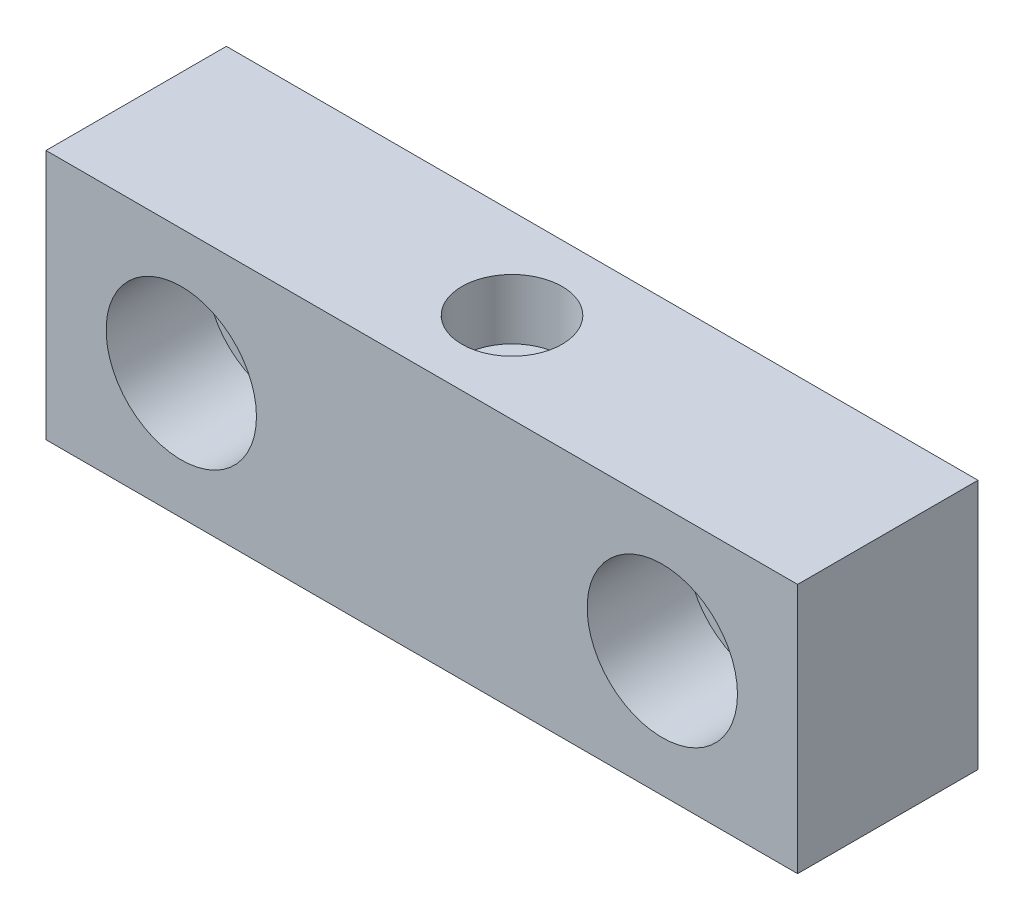
ISO-10303-21;
HEADER;
FILE_DESCRIPTION(('STEP AP214'),'2;1');
FILE_NAME('part.step','',(''),(''),'','','');
FILE_SCHEMA(('AUTOMOTIVE_DESIGN { 1 0 10303 214 1 1 1 1 }'));
ENDSEC;
DATA;
#1=APPLICATION_CONTEXT('core data for automotive mechanical design processes');
#2=APPLICATION_PROTOCOL_DEFINITION('international standard','automotive_design',2000,#1);
#3=PRODUCT_CONTEXT('',#1,'mechanical');
#4=PRODUCT('Part','Part','',(#3));
#5=PRODUCT_RELATED_PRODUCT_CATEGORY('part','',(#4));
#6=PRODUCT_DEFINITION_FORMATION('','',#4);
#7=PRODUCT_DEFINITION_CONTEXT('part definition',#1,'design');
#8=PRODUCT_DEFINITION('design','',#6,#7);
#9=PRODUCT_DEFINITION_SHAPE('','',#8);
#10=(LENGTH_UNIT() NAMED_UNIT(*) SI_UNIT(.MILLI.,.METRE.));
#11=(NAMED_UNIT(*) PLANE_ANGLE_UNIT() SI_UNIT($,.RADIAN.));
#12=(NAMED_UNIT(*) SI_UNIT($,.STERADIAN.) SOLID_ANGLE_UNIT());
#13=UNCERTAINTY_MEASURE_WITH_UNIT(LENGTH_MEASURE(1.E-05),#10,'distance_accuracy_value','');
#14=(GEOMETRIC_REPRESENTATION_CONTEXT(3) GLOBAL_UNCERTAINTY_ASSIGNED_CONTEXT((#13)) GLOBAL_UNIT_ASSIGNED_CONTEXT((#10,
#11,#12)) REPRESENTATION_CONTEXT('',''));
#15=CARTESIAN_POINT('',(0.,0.,0.));
#16=DIRECTION('',(0.,0.,1.));
#17=DIRECTION('',(1.,0.,0.));
#18=AXIS2_PLACEMENT_3D('',#15,#16,#17);
#19=CARTESIAN_POINT('',(0.,12.5,9.));
#20=DIRECTION('',(0.,-1.,0.));
#21=DIRECTION('',(0.,0.,-1.));
#22=AXIS2_PLACEMENT_3D('',#19,#20,#21);
#23=CYLINDRICAL_SURFACE('',#22,2.5);
#24=CARTESIAN_POINT('',(0.,-12.5,9.));
#25=DIRECTION('',(0.,-1.,0.));
#26=DIRECTION('',(0.,0.,-1.));
#27=AXIS2_PLACEMENT_3D('',#24,#25,#26);
#28=CIRCLE('',#27,2.5);
#29=CARTESIAN_POINT('',(0.,-12.5,6.5));
#30=VERTEX_POINT('',#29);
#31=EDGE_CURVE('E137',#30,#30,#28,.T.);
#32=ORIENTED_EDGE('',*,*,#31,.T.);
#33=EDGE_LOOP('',(#32));
#34=FACE_BOUND('',#33,.T.);
#35=CARTESIAN_POINT('',(0.,6.5,9.));
#36=DIRECTION('',(0.,1.,0.));
#37=DIRECTION('',(0.,0.,1.));
#38=AXIS2_PLACEMENT_3D('',#35,#36,#37);
#39=CIRCLE('',#38,2.5);
#40=CARTESIAN_POINT('',(0.,6.5,11.5));
#41=VERTEX_POINT('',#40);
#42=EDGE_CURVE('E42',#41,#41,#39,.F.);
#43=ORIENTED_EDGE('',*,*,#42,.F.);
#44=EDGE_LOOP('',(#43));
#45=FACE_BOUND('',#44,.T.);
#46=ADVANCED_FACE('F38',(#34,#45),#23,.F.);
#47=CARTESIAN_POINT('',(37.5,-12.5,18.));
#48=DIRECTION('',(-1.,0.,0.));
#49=DIRECTION('',(0.,0.,1.));
#50=AXIS2_PLACEMENT_3D('',#47,#48,#49);
#51=PLANE('',#50);
#52=DIRECTION('',(0.,1.,0.));
#53=VECTOR('',#52,1.);
#54=CARTESIAN_POINT('',(37.5,-12.5,0.));
#55=LINE('',#54,#53);
#56=CARTESIAN_POINT('',(37.5,-12.5,0.));
#57=VERTEX_POINT('',#56);
#58=CARTESIAN_POINT('',(37.5,12.5,0.));
#59=VERTEX_POINT('',#58);
#60=EDGE_CURVE('E110',#57,#59,#55,.T.);
#61=ORIENTED_EDGE('',*,*,#60,.T.);
#62=DIRECTION('',(0.,0.,-1.));
#63=VECTOR('',#62,1.);
#64=CARTESIAN_POINT('',(37.5,12.5,18.));
#65=LINE('',#64,#63);
#66=CARTESIAN_POINT('',(37.5,12.5,18.));
#67=VERTEX_POINT('',#66);
#68=EDGE_CURVE('E11',#67,#59,#65,.T.);
#69=ORIENTED_EDGE('',*,*,#68,.F.);
#70=DIRECTION('',(0.,1.,0.));
#71=VECTOR('',#70,1.);
#72=CARTESIAN_POINT('',(37.5,-12.5,18.));
#73=LINE('',#72,#71);
#74=CARTESIAN_POINT('',(37.5,-12.5,18.));
#75=VERTEX_POINT('',#74);
#76=EDGE_CURVE('E92',#75,#67,#73,.T.);
#77=ORIENTED_EDGE('',*,*,#76,.F.);
#78=DIRECTION('',(0.,0.,-1.));
#79=VECTOR('',#78,1.);
#80=CARTESIAN_POINT('',(37.5,-12.5,18.));
#81=LINE('',#80,#79);
#82=EDGE_CURVE('E106',#75,#57,#81,.T.);
#83=ORIENTED_EDGE('',*,*,#82,.T.);
#84=EDGE_LOOP('',(#61,#69,#77,#83));
#85=FACE_BOUND('',#84,.T.);
#86=ADVANCED_FACE('F40',(#85),#51,.F.);
#87=CARTESIAN_POINT('',(-37.5,12.5,18.));
#88=DIRECTION('',(0.,-1.,0.));
#89=DIRECTION('',(0.,0.,-1.));
#90=AXIS2_PLACEMENT_3D('',#87,#88,#89);
#91=PLANE('',#90);
#92=CARTESIAN_POINT('',(0.,12.5,9.));
#93=DIRECTION('',(0.,1.,0.));
#94=DIRECTION('',(0.,0.,1.));
#95=AXIS2_PLACEMENT_3D('',#92,#93,#94);
#96=CIRCLE('',#95,5.);
#97=CARTESIAN_POINT('',(0.,12.5,14.));
#98=VERTEX_POINT('',#97);
#99=EDGE_CURVE('E149',#98,#98,#96,.T.);
#100=ORIENTED_EDGE('',*,*,#99,.F.);
#101=EDGE_LOOP('',(#100));
#102=FACE_BOUND('',#101,.T.);
#103=DIRECTION('',(-1.,0.,0.));
#104=VECTOR('',#103,1.);
#105=CARTESIAN_POINT('',(-37.5,12.5,0.));
#106=LINE('',#105,#104);
#107=CARTESIAN_POINT('',(-37.5,12.5,0.));
#108=VERTEX_POINT('',#107);
#109=EDGE_CURVE('E97',#59,#108,#106,.T.);
#110=ORIENTED_EDGE('',*,*,#109,.T.);
#111=DIRECTION('',(0.,0.,-1.));
#112=VECTOR('',#111,1.);
#113=CARTESIAN_POINT('',(-37.5,12.5,18.));
#114=LINE('',#113,#112);
#115=CARTESIAN_POINT('',(-37.5,12.5,18.));
#116=VERTEX_POINT('',#115);
#117=EDGE_CURVE('E49',#116,#108,#114,.T.);
#118=ORIENTED_EDGE('',*,*,#117,.F.);
#119=DIRECTION('',(-1.,0.,0.));
#120=VECTOR('',#119,1.);
#121=CARTESIAN_POINT('',(-37.5,12.5,18.));
#122=LINE('',#121,#120);
#123=EDGE_CURVE('E87',#67,#116,#122,.T.);
#124=ORIENTED_EDGE('',*,*,#123,.F.);
#125=ORIENTED_EDGE('',*,*,#68,.T.);
#126=EDGE_LOOP('',(#110,#118,#124,#125));
#127=FACE_BOUND('',#126,.T.);
#128=ADVANCED_FACE('F96',(#102,#127),#91,.F.);
#129=CARTESIAN_POINT('',(-37.5,-12.5,18.));
#130=DIRECTION('',(1.,0.,0.));
#131=DIRECTION('',(0.,0.,-1.));
#132=AXIS2_PLACEMENT_3D('',#129,#130,#131);
#133=PLANE('',#132);
#134=DIRECTION('',(0.,-1.,0.));
#135=VECTOR('',#134,1.);
#136=CARTESIAN_POINT('',(-37.5,-12.5,0.));
#137=LINE('',#136,#135);
#138=CARTESIAN_POINT('',(-37.5,-12.5,0.));
#139=VERTEX_POINT('',#138);
#140=EDGE_CURVE('E74',#108,#139,#137,.T.);
#141=ORIENTED_EDGE('',*,*,#140,.T.);
#142=DIRECTION('',(0.,0.,-1.));
#143=VECTOR('',#142,1.);
#144=CARTESIAN_POINT('',(-37.5,-12.5,18.));
#145=LINE('',#144,#143);
#146=CARTESIAN_POINT('',(-37.5,-12.5,18.));
#147=VERTEX_POINT('',#146);
#148=EDGE_CURVE('E99',#147,#139,#145,.T.);
#149=ORIENTED_EDGE('',*,*,#148,.F.);
#150=DIRECTION('',(0.,-1.,0.));
#151=VECTOR('',#150,1.);
#152=CARTESIAN_POINT('',(-37.5,-12.5,18.));
#153=LINE('',#152,#151);
#154=EDGE_CURVE('E90',#116,#147,#153,.T.);
#155=ORIENTED_EDGE('',*,*,#154,.F.);
#156=ORIENTED_EDGE('',*,*,#117,.T.);
#157=EDGE_LOOP('',(#141,#149,#155,#156));
#158=FACE_BOUND('',#157,.T.);
#159=ADVANCED_FACE('F101',(#158),#133,.F.);
#160=CARTESIAN_POINT('',(-37.5,-12.5,18.));
#161=DIRECTION('',(0.,1.,0.));
#162=DIRECTION('',(0.,0.,1.));
#163=AXIS2_PLACEMENT_3D('',#160,#161,#162);
#164=PLANE('',#163);
#165=ORIENTED_EDGE('',*,*,#31,.F.);
#166=EDGE_LOOP('',(#165));
#167=FACE_BOUND('',#166,.T.);
#168=DIRECTION('',(1.,0.,0.));
#169=VECTOR('',#168,1.);
#170=CARTESIAN_POINT('',(-37.5,-12.5,0.));
#171=LINE('',#170,#169);
#172=EDGE_CURVE('E80',#139,#57,#171,.T.);
#173=ORIENTED_EDGE('',*,*,#172,.T.);
#174=ORIENTED_EDGE('',*,*,#82,.F.);
#175=DIRECTION('',(1.,0.,0.));
#176=VECTOR('',#175,1.);
#177=CARTESIAN_POINT('',(-37.5,-12.5,18.));
#178=LINE('',#177,#176);
#179=EDGE_CURVE('E57',#147,#75,#178,.T.);
#180=ORIENTED_EDGE('',*,*,#179,.F.);
#181=ORIENTED_EDGE('',*,*,#148,.T.);
#182=EDGE_LOOP('',(#173,#174,#180,#181));
#183=FACE_BOUND('',#182,.T.);
#184=ADVANCED_FACE('F124',(#167,#183),#164,.F.);
#185=CARTESIAN_POINT('',(0.,0.,18.));
#186=DIRECTION('',(0.,0.,-1.));
#187=DIRECTION('',(-1.,0.,0.));
#188=AXIS2_PLACEMENT_3D('',#185,#186,#187);
#189=PLANE('',#188);
#190=CARTESIAN_POINT('',(-24.,0.,18.));
#191=DIRECTION('',(0.,0.,1.));
#192=DIRECTION('',(1.,0.,0.));
#193=AXIS2_PLACEMENT_3D('',#190,#191,#192);
#194=CIRCLE('',#193,7.5);
#195=CARTESIAN_POINT('',(-16.5,0.,18.));
#196=VERTEX_POINT('',#195);
#197=EDGE_CURVE('E141',#196,#196,#194,.T.);
#198=ORIENTED_EDGE('',*,*,#197,.F.);
#199=EDGE_LOOP('',(#198));
#200=FACE_BOUND('',#199,.T.);
#201=CARTESIAN_POINT('',(24.,0.,18.));
#202=DIRECTION('',(0.,0.,1.));
#203=DIRECTION('',(1.,0.,0.));
#204=AXIS2_PLACEMENT_3D('',#201,#202,#203);
#205=CIRCLE('',#204,7.5);
#206=CARTESIAN_POINT('',(31.5,0.,18.));
#207=VERTEX_POINT('',#206);
#208=EDGE_CURVE('E132',#207,#207,#205,.T.);
#209=ORIENTED_EDGE('',*,*,#208,.F.);
#210=EDGE_LOOP('',(#209));
#211=FACE_BOUND('',#210,.T.);
#212=ORIENTED_EDGE('',*,*,#76,.T.);
#213=ORIENTED_EDGE('',*,*,#123,.T.);
#214=ORIENTED_EDGE('',*,*,#154,.T.);
#215=ORIENTED_EDGE('',*,*,#179,.T.);
#216=EDGE_LOOP('',(#212,#213,#214,#215));
#217=FACE_BOUND('',#216,.T.);
#218=ADVANCED_FACE('F88',(#200,#211,#217),#189,.F.);
#219=CARTESIAN_POINT('',(0.,0.,0.));
#220=DIRECTION('',(0.,0.,-1.));
#221=DIRECTION('',(-1.,0.,0.));
#222=AXIS2_PLACEMENT_3D('',#219,#220,#221);
#223=PLANE('',#222);
#224=ORIENTED_EDGE('',*,*,#60,.F.);
#225=ORIENTED_EDGE('',*,*,#172,.F.);
#226=ORIENTED_EDGE('',*,*,#140,.F.);
#227=ORIENTED_EDGE('',*,*,#109,.F.);
#228=EDGE_LOOP('',(#224,#225,#226,#227));
#229=FACE_BOUND('',#228,.T.);
#230=ADVANCED_FACE('F127',(#229),#223,.T.);
#231=CARTESIAN_POINT('',(24.,0.,8.));
#232=DIRECTION('',(0.,0.,1.));
#233=DIRECTION('',(1.,0.,0.));
#234=AXIS2_PLACEMENT_3D('',#231,#232,#233);
#235=CYLINDRICAL_SURFACE('',#234,7.5);
#236=CARTESIAN_POINT('',(24.,0.,8.));
#237=DIRECTION('',(0.,0.,1.));
#238=DIRECTION('',(1.,0.,0.));
#239=AXIS2_PLACEMENT_3D('',#236,#237,#238);
#240=CIRCLE('',#239,7.5);
#241=CARTESIAN_POINT('',(31.5,0.,8.));
#242=VERTEX_POINT('',#241);
#243=EDGE_CURVE('E136',#242,#242,#240,.T.);
#244=ORIENTED_EDGE('',*,*,#243,.F.);
#245=EDGE_LOOP('',(#244));
#246=FACE_BOUND('',#245,.T.);
#247=ORIENTED_EDGE('',*,*,#208,.T.);
#248=EDGE_LOOP('',(#247));
#249=FACE_BOUND('',#248,.T.);
#250=ADVANCED_FACE('F185',(#246,#249),#235,.F.);
#251=CARTESIAN_POINT('',(24.,0.,8.));
#252=DIRECTION('',(0.,0.,1.));
#253=DIRECTION('',(1.,0.,0.));
#254=AXIS2_PLACEMENT_3D('',#251,#252,#253);
#255=PLANE('',#254);
#256=ORIENTED_EDGE('',*,*,#243,.T.);
#257=EDGE_LOOP('',(#256));
#258=FACE_BOUND('',#257,.T.);
#259=ADVANCED_FACE('F181',(#258),#255,.T.);
#260=CARTESIAN_POINT('',(-24.,0.,8.));
#261=DIRECTION('',(0.,0.,1.));
#262=DIRECTION('',(1.,0.,0.));
#263=AXIS2_PLACEMENT_3D('',#260,#261,#262);
#264=CYLINDRICAL_SURFACE('',#263,7.5);
#265=CARTESIAN_POINT('',(-24.,0.,8.));
#266=DIRECTION('',(0.,0.,1.));
#267=DIRECTION('',(1.,0.,0.));
#268=AXIS2_PLACEMENT_3D('',#265,#266,#267);
#269=CIRCLE('',#268,7.5);
#270=CARTESIAN_POINT('',(-16.5,0.,8.));
#271=VERTEX_POINT('',#270);
#272=EDGE_CURVE('E114',#271,#271,#269,.T.);
#273=ORIENTED_EDGE('',*,*,#272,.F.);
#274=EDGE_LOOP('',(#273));
#275=FACE_BOUND('',#274,.T.);
#276=ORIENTED_EDGE('',*,*,#197,.T.);
#277=EDGE_LOOP('',(#276));
#278=FACE_BOUND('',#277,.T.);
#279=ADVANCED_FACE('F177',(#275,#278),#264,.F.);
#280=CARTESIAN_POINT('',(-24.,0.,8.));
#281=DIRECTION('',(0.,0.,1.));
#282=DIRECTION('',(1.,0.,0.));
#283=AXIS2_PLACEMENT_3D('',#280,#281,#282);
#284=PLANE('',#283);
#285=ORIENTED_EDGE('',*,*,#272,.T.);
#286=EDGE_LOOP('',(#285));
#287=FACE_BOUND('',#286,.T.);
#288=ADVANCED_FACE('F174',(#287),#284,.T.);
#289=CARTESIAN_POINT('',(0.,6.5,9.));
#290=DIRECTION('',(0.,1.,0.));
#291=DIRECTION('',(0.,0.,1.));
#292=AXIS2_PLACEMENT_3D('',#289,#290,#291);
#293=PLANE('',#292);
#294=CARTESIAN_POINT('',(0.,6.5,9.));
#295=DIRECTION('',(0.,1.,0.));
#296=DIRECTION('',(0.,0.,1.));
#297=AXIS2_PLACEMENT_3D('',#294,#295,#296);
#298=CIRCLE('',#297,5.);
#299=CARTESIAN_POINT('',(0.,6.5,14.));
#300=VERTEX_POINT('',#299);
#301=EDGE_CURVE('E153',#300,#300,#298,.T.);
#302=ORIENTED_EDGE('',*,*,#301,.T.);
#303=EDGE_LOOP('',(#302));
#304=FACE_BOUND('',#303,.T.);
#305=ORIENTED_EDGE('',*,*,#42,.T.);
#306=EDGE_LOOP('',(#305));
#307=FACE_BOUND('',#306,.T.);
#308=ADVANCED_FACE('F162',(#304,#307),#293,.T.);
#309=CARTESIAN_POINT('',(0.,6.5,9.));
#310=DIRECTION('',(0.,1.,0.));
#311=DIRECTION('',(0.,0.,1.));
#312=AXIS2_PLACEMENT_3D('',#309,#310,#311);
#313=CYLINDRICAL_SURFACE('',#312,5.);
#314=ORIENTED_EDGE('',*,*,#301,.F.);
#315=EDGE_LOOP('',(#314));
#316=FACE_BOUND('',#315,.T.);
#317=ORIENTED_EDGE('',*,*,#99,.T.);
#318=EDGE_LOOP('',(#317));
#319=FACE_BOUND('',#318,.T.);
#320=ADVANCED_FACE('F172',(#316,#319),#313,.F.);
#321=CLOSED_SHELL('',(#46,#86,#128,#159,#184,#218,#230,#250,#259,#279,#288,#308,#320));
#322=MANIFOLD_SOLID_BREP('B2',#321);
#323=ADVANCED_BREP_SHAPE_REPRESENTATION('',(#18,#322),#14);
#324=SHAPE_DEFINITION_REPRESENTATION(#9,#323);
ENDSEC;
END-ISO-10303-21;
